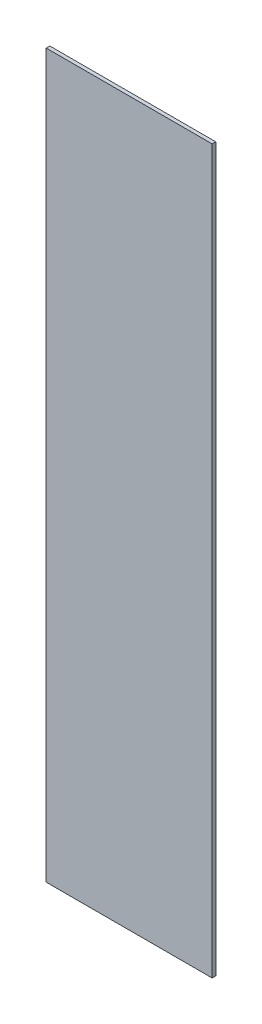
ISO-10303-21;
HEADER;
FILE_DESCRIPTION(('STEP AP214'),'2;1');
FILE_NAME('part.step','',(''),(''),'','','');
FILE_SCHEMA(('AUTOMOTIVE_DESIGN { 1 0 10303 214 1 1 1 1 }'));
ENDSEC;
DATA;
#1=APPLICATION_CONTEXT('core data for automotive mechanical design processes');
#2=APPLICATION_PROTOCOL_DEFINITION('international standard','automotive_design',2000,#1);
#3=PRODUCT_CONTEXT('',#1,'mechanical');
#4=PRODUCT('Part','Part','',(#3));
#5=PRODUCT_RELATED_PRODUCT_CATEGORY('part','',(#4));
#6=PRODUCT_DEFINITION_FORMATION('','',#4);
#7=PRODUCT_DEFINITION_CONTEXT('part definition',#1,'design');
#8=PRODUCT_DEFINITION('design','',#6,#7);
#9=PRODUCT_DEFINITION_SHAPE('','',#8);
#10=(LENGTH_UNIT() NAMED_UNIT(*) SI_UNIT(.MILLI.,.METRE.));
#11=(NAMED_UNIT(*) PLANE_ANGLE_UNIT() SI_UNIT($,.RADIAN.));
#12=(NAMED_UNIT(*) SI_UNIT($,.STERADIAN.) SOLID_ANGLE_UNIT());
#13=UNCERTAINTY_MEASURE_WITH_UNIT(LENGTH_MEASURE(1.E-05),#10,'distance_accuracy_value','');
#14=(GEOMETRIC_REPRESENTATION_CONTEXT(3) GLOBAL_UNCERTAINTY_ASSIGNED_CONTEXT((#13)) GLOBAL_UNIT_ASSIGNED_CONTEXT((#10,
#11,#12)) REPRESENTATION_CONTEXT('',''));
#15=CARTESIAN_POINT('',(0.,0.,0.));
#16=DIRECTION('',(0.,0.,1.));
#17=DIRECTION('',(1.,0.,0.));
#18=AXIS2_PLACEMENT_3D('',#15,#16,#17);
#19=CARTESIAN_POINT('',(45.93,400.,-1.));
#20=DIRECTION('',(-1.,0.,0.));
#21=DIRECTION('',(0.,0.,1.));
#22=AXIS2_PLACEMENT_3D('',#19,#20,#21);
#23=PLANE('',#22);
#24=DIRECTION('',(0.,0.,-1.));
#25=VECTOR('',#24,1.);
#26=CARTESIAN_POINT('',(45.93,0.,-1.));
#27=LINE('',#26,#25);
#28=CARTESIAN_POINT('',(45.93,0.,1.));
#29=VERTEX_POINT('',#28);
#30=CARTESIAN_POINT('',(45.93,0.,-1.));
#31=VERTEX_POINT('',#30);
#32=EDGE_CURVE('E107',#29,#31,#27,.T.);
#33=ORIENTED_EDGE('',*,*,#32,.T.);
#34=DIRECTION('',(0.,-1.,0.));
#35=VECTOR('',#34,1.);
#36=CARTESIAN_POINT('',(45.93,400.,-1.));
#37=LINE('',#36,#35);
#38=CARTESIAN_POINT('',(45.93,400.,-1.));
#39=VERTEX_POINT('',#38);
#40=EDGE_CURVE('E11',#39,#31,#37,.T.);
#41=ORIENTED_EDGE('',*,*,#40,.F.);
#42=DIRECTION('',(0.,0.,-1.));
#43=VECTOR('',#42,1.);
#44=CARTESIAN_POINT('',(45.93,400.,-1.));
#45=LINE('',#44,#43);
#46=CARTESIAN_POINT('',(45.93,400.,1.));
#47=VERTEX_POINT('',#46);
#48=EDGE_CURVE('E91',#47,#39,#45,.T.);
#49=ORIENTED_EDGE('',*,*,#48,.F.);
#50=DIRECTION('',(0.,-1.,0.));
#51=VECTOR('',#50,1.);
#52=CARTESIAN_POINT('',(45.93,400.,1.));
#53=LINE('',#52,#51);
#54=EDGE_CURVE('E103',#47,#29,#53,.T.);
#55=ORIENTED_EDGE('',*,*,#54,.T.);
#56=EDGE_LOOP('',(#33,#41,#49,#55));
#57=FACE_BOUND('',#56,.T.);
#58=ADVANCED_FACE('F39',(#57),#23,.F.);
#59=CARTESIAN_POINT('',(-45.93,400.,-1.));
#60=DIRECTION('',(0.,0.,1.));
#61=DIRECTION('',(1.,0.,0.));
#62=AXIS2_PLACEMENT_3D('',#59,#60,#61);
#63=PLANE('',#62);
#64=DIRECTION('',(-1.,0.,0.));
#65=VECTOR('',#64,1.);
#66=CARTESIAN_POINT('',(-45.93,0.,-1.));
#67=LINE('',#66,#65);
#68=CARTESIAN_POINT('',(-45.93,0.,-1.));
#69=VERTEX_POINT('',#68);
#70=EDGE_CURVE('E96',#31,#69,#67,.T.);
#71=ORIENTED_EDGE('',*,*,#70,.T.);
#72=DIRECTION('',(0.,-1.,0.));
#73=VECTOR('',#72,1.);
#74=CARTESIAN_POINT('',(-45.93,400.,-1.));
#75=LINE('',#74,#73);
#76=CARTESIAN_POINT('',(-45.93,400.,-1.));
#77=VERTEX_POINT('',#76);
#78=EDGE_CURVE('E48',#77,#69,#75,.T.);
#79=ORIENTED_EDGE('',*,*,#78,.F.);
#80=DIRECTION('',(-1.,0.,0.));
#81=VECTOR('',#80,1.);
#82=CARTESIAN_POINT('',(-45.93,400.,-1.));
#83=LINE('',#82,#81);
#84=EDGE_CURVE('E86',#39,#77,#83,.T.);
#85=ORIENTED_EDGE('',*,*,#84,.F.);
#86=ORIENTED_EDGE('',*,*,#40,.T.);
#87=EDGE_LOOP('',(#71,#79,#85,#86));
#88=FACE_BOUND('',#87,.T.);
#89=ADVANCED_FACE('F95',(#88),#63,.F.);
#90=CARTESIAN_POINT('',(-45.93,400.,-1.));
#91=DIRECTION('',(1.,0.,0.));
#92=DIRECTION('',(0.,0.,-1.));
#93=AXIS2_PLACEMENT_3D('',#90,#91,#92);
#94=PLANE('',#93);
#95=DIRECTION('',(0.,0.,1.));
#96=VECTOR('',#95,1.);
#97=CARTESIAN_POINT('',(-45.93,0.,-1.));
#98=LINE('',#97,#96);
#99=CARTESIAN_POINT('',(-45.93,0.,1.));
#100=VERTEX_POINT('',#99);
#101=EDGE_CURVE('E73',#69,#100,#98,.T.);
#102=ORIENTED_EDGE('',*,*,#101,.T.);
#103=DIRECTION('',(0.,-1.,0.));
#104=VECTOR('',#103,1.);
#105=CARTESIAN_POINT('',(-45.93,400.,1.));
#106=LINE('',#105,#104);
#107=CARTESIAN_POINT('',(-45.93,400.,1.));
#108=VERTEX_POINT('',#107);
#109=EDGE_CURVE('E98',#108,#100,#106,.T.);
#110=ORIENTED_EDGE('',*,*,#109,.F.);
#111=DIRECTION('',(0.,0.,1.));
#112=VECTOR('',#111,1.);
#113=CARTESIAN_POINT('',(-45.93,400.,-1.));
#114=LINE('',#113,#112);
#115=EDGE_CURVE('E89',#77,#108,#114,.T.);
#116=ORIENTED_EDGE('',*,*,#115,.F.);
#117=ORIENTED_EDGE('',*,*,#78,.T.);
#118=EDGE_LOOP('',(#102,#110,#116,#117));
#119=FACE_BOUND('',#118,.T.);
#120=ADVANCED_FACE('F99',(#119),#94,.F.);
#121=CARTESIAN_POINT('',(-45.93,400.,1.));
#122=DIRECTION('',(0.,0.,-1.));
#123=DIRECTION('',(-1.,0.,0.));
#124=AXIS2_PLACEMENT_3D('',#121,#122,#123);
#125=PLANE('',#124);
#126=DIRECTION('',(1.,0.,0.));
#127=VECTOR('',#126,1.);
#128=CARTESIAN_POINT('',(-45.93,0.,1.));
#129=LINE('',#128,#127);
#130=EDGE_CURVE('E79',#100,#29,#129,.T.);
#131=ORIENTED_EDGE('',*,*,#130,.T.);
#132=ORIENTED_EDGE('',*,*,#54,.F.);
#133=DIRECTION('',(1.,0.,0.));
#134=VECTOR('',#133,1.);
#135=CARTESIAN_POINT('',(-45.93,400.,1.));
#136=LINE('',#135,#134);
#137=EDGE_CURVE('E56',#108,#47,#136,.T.);
#138=ORIENTED_EDGE('',*,*,#137,.F.);
#139=ORIENTED_EDGE('',*,*,#109,.T.);
#140=EDGE_LOOP('',(#131,#132,#138,#139));
#141=FACE_BOUND('',#140,.T.);
#142=ADVANCED_FACE('F120',(#141),#125,.F.);
#143=CARTESIAN_POINT('',(0.,400.,0.));
#144=DIRECTION('',(0.,1.,0.));
#145=DIRECTION('',(0.,0.,1.));
#146=AXIS2_PLACEMENT_3D('',#143,#144,#145);
#147=PLANE('',#146);
#148=ORIENTED_EDGE('',*,*,#48,.T.);
#149=ORIENTED_EDGE('',*,*,#84,.T.);
#150=ORIENTED_EDGE('',*,*,#115,.T.);
#151=ORIENTED_EDGE('',*,*,#137,.T.);
#152=EDGE_LOOP('',(#148,#149,#150,#151));
#153=FACE_BOUND('',#152,.T.);
#154=ADVANCED_FACE('F87',(#153),#147,.T.);
#155=CARTESIAN_POINT('',(0.,0.,0.));
#156=DIRECTION('',(0.,1.,0.));
#157=DIRECTION('',(0.,0.,1.));
#158=AXIS2_PLACEMENT_3D('',#155,#156,#157);
#159=PLANE('',#158);
#160=ORIENTED_EDGE('',*,*,#32,.F.);
#161=ORIENTED_EDGE('',*,*,#130,.F.);
#162=ORIENTED_EDGE('',*,*,#101,.F.);
#163=ORIENTED_EDGE('',*,*,#70,.F.);
#164=EDGE_LOOP('',(#160,#161,#162,#163));
#165=FACE_BOUND('',#164,.T.);
#166=ADVANCED_FACE('F123',(#165),#159,.F.);
#167=CLOSED_SHELL('',(#58,#89,#120,#142,#154,#166));
#168=MANIFOLD_SOLID_BREP('B2',#167);
#169=ADVANCED_BREP_SHAPE_REPRESENTATION('',(#18,#168),#14);
#170=SHAPE_DEFINITION_REPRESENTATION(#9,#169);
ENDSEC;
END-ISO-10303-21;
